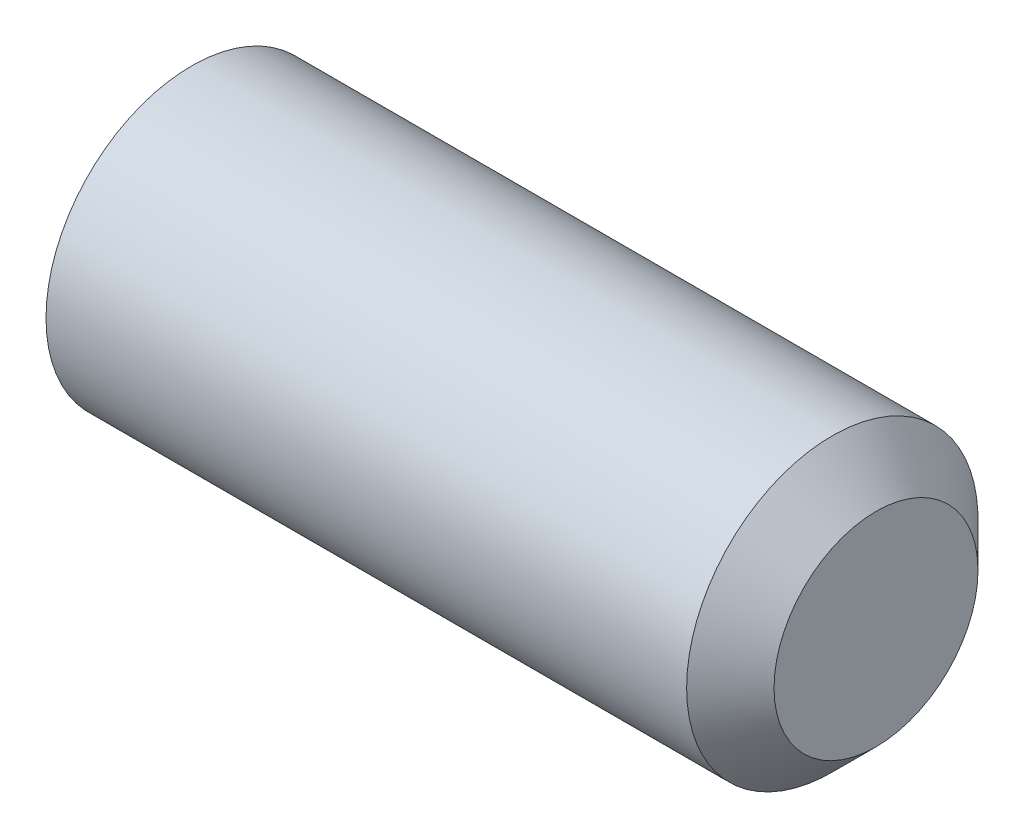
ISO-10303-21;
HEADER;
FILE_DESCRIPTION(('STEP AP214'),'2;1');
FILE_NAME('part.step','',(''),(''),'','','');
FILE_SCHEMA(('AUTOMOTIVE_DESIGN { 1 0 10303 214 1 1 1 1 }'));
ENDSEC;
DATA;
#1=APPLICATION_CONTEXT('core data for automotive mechanical design processes');
#2=APPLICATION_PROTOCOL_DEFINITION('international standard','automotive_design',2000,#1);
#3=PRODUCT_CONTEXT('',#1,'mechanical');
#4=PRODUCT('Part','Part','',(#3));
#5=PRODUCT_RELATED_PRODUCT_CATEGORY('part','',(#4));
#6=PRODUCT_DEFINITION_FORMATION('','',#4);
#7=PRODUCT_DEFINITION_CONTEXT('part definition',#1,'design');
#8=PRODUCT_DEFINITION('design','',#6,#7);
#9=PRODUCT_DEFINITION_SHAPE('','',#8);
#10=(LENGTH_UNIT() NAMED_UNIT(*) SI_UNIT(.MILLI.,.METRE.));
#11=(NAMED_UNIT(*) PLANE_ANGLE_UNIT() SI_UNIT($,.RADIAN.));
#12=(NAMED_UNIT(*) SI_UNIT($,.STERADIAN.) SOLID_ANGLE_UNIT());
#13=UNCERTAINTY_MEASURE_WITH_UNIT(LENGTH_MEASURE(1.E-05),#10,'distance_accuracy_value','');
#14=(GEOMETRIC_REPRESENTATION_CONTEXT(3) GLOBAL_UNCERTAINTY_ASSIGNED_CONTEXT((#13)) GLOBAL_UNIT_ASSIGNED_CONTEXT((#10,
#11,#12)) REPRESENTATION_CONTEXT('',''));
#15=CARTESIAN_POINT('',(0.,0.,0.));
#16=DIRECTION('',(0.,0.,1.));
#17=DIRECTION('',(1.,0.,0.));
#18=AXIS2_PLACEMENT_3D('',#15,#16,#17);
#19=CARTESIAN_POINT('',(0.,0.,0.));
#20=DIRECTION('',(-1.,0.,0.));
#21=DIRECTION('',(0.,0.,1.));
#22=AXIS2_PLACEMENT_3D('',#19,#20,#21);
#23=PLANE('',#22);
#24=CARTESIAN_POINT('',(0.,0.,0.));
#25=DIRECTION('',(-1.,0.,0.));
#26=DIRECTION('',(0.,0.,1.));
#27=AXIS2_PLACEMENT_3D('',#24,#25,#26);
#28=CIRCLE('',#27,2.055);
#29=CARTESIAN_POINT('',(0.,0.,2.055));
#30=VERTEX_POINT('',#29);
#31=EDGE_CURVE('E137',#30,#30,#28,.T.);
#32=ORIENTED_EDGE('',*,*,#31,.T.);
#33=EDGE_LOOP('',(#32));
#34=FACE_BOUND('',#33,.T.);
#35=DIRECTION('',(0.,0.,-1.));
#36=VECTOR('',#35,1.);
#37=CARTESIAN_POINT('',(0.,1.25,0.721687836487029));
#38=LINE('',#37,#36);
#39=CARTESIAN_POINT('',(0.,1.25,0.721687836487029));
#40=VERTEX_POINT('',#39);
#41=CARTESIAN_POINT('',(0.,1.25,-0.721687836487035));
#42=VERTEX_POINT('',#41);
#43=EDGE_CURVE('E128',#40,#42,#38,.T.);
#44=ORIENTED_EDGE('',*,*,#43,.F.);
#45=DIRECTION('',(0.,-0.866025403784438,0.5));
#46=VECTOR('',#45,1.);
#47=CARTESIAN_POINT('',(0.,1.25,0.721687836487029));
#48=LINE('',#47,#46);
#49=CARTESIAN_POINT('',(0.,0.,1.44337567297406));
#50=VERTEX_POINT('',#49);
#51=EDGE_CURVE('E50',#40,#50,#48,.T.);
#52=ORIENTED_EDGE('',*,*,#51,.T.);
#53=DIRECTION('',(0.,0.866025403784439,0.5));
#54=VECTOR('',#53,1.);
#55=CARTESIAN_POINT('',(0.,-1.25,0.72168783648703));
#56=LINE('',#55,#54);
#57=CARTESIAN_POINT('',(0.,-1.25,0.72168783648703));
#58=VERTEX_POINT('',#57);
#59=EDGE_CURVE('E119',#58,#50,#56,.T.);
#60=ORIENTED_EDGE('',*,*,#59,.F.);
#61=DIRECTION('',(0.,0.,-1.));
#62=VECTOR('',#61,1.);
#63=CARTESIAN_POINT('',(0.,-1.25,0.72168783648703));
#64=LINE('',#63,#62);
#65=CARTESIAN_POINT('',(0.,-1.25,-0.721687836487034));
#66=VERTEX_POINT('',#65);
#67=EDGE_CURVE('E122',#58,#66,#64,.T.);
#68=ORIENTED_EDGE('',*,*,#67,.T.);
#69=DIRECTION('',(0.,0.866025403784438,-0.500000000000001));
#70=VECTOR('',#69,1.);
#71=CARTESIAN_POINT('',(0.,-1.25,-0.721687836487034));
#72=LINE('',#71,#70);
#73=CARTESIAN_POINT('',(0.,0.,-1.44337567297407));
#74=VERTEX_POINT('',#73);
#75=EDGE_CURVE('E125',#66,#74,#72,.T.);
#76=ORIENTED_EDGE('',*,*,#75,.T.);
#77=DIRECTION('',(0.,-0.866025403784439,-0.5));
#78=VECTOR('',#77,1.);
#79=CARTESIAN_POINT('',(0.,1.25,-0.721687836487035));
#80=LINE('',#79,#78);
#81=EDGE_CURVE('E108',#42,#74,#80,.T.);
#82=ORIENTED_EDGE('',*,*,#81,.F.);
#83=EDGE_LOOP('',(#44,#52,#60,#68,#76,#82));
#84=FACE_BOUND('',#83,.T.);
#85=ADVANCED_FACE('F35',(#34,#84),#23,.T.);
#86=CARTESIAN_POINT('',(12.,1.75,0.));
#87=DIRECTION('',(1.,0.,0.));
#88=DIRECTION('',(0.,0.,-1.));
#89=AXIS2_PLACEMENT_3D('',#86,#87,#88);
#90=PLANE('',#89);
#91=CARTESIAN_POINT('',(12.,0.,0.));
#92=DIRECTION('',(-1.,0.,0.));
#93=DIRECTION('',(0.,0.,1.));
#94=AXIS2_PLACEMENT_3D('',#91,#92,#93);
#95=CIRCLE('',#94,1.75);
#96=CARTESIAN_POINT('',(12.,0.,1.75));
#97=VERTEX_POINT('',#96);
#98=EDGE_CURVE('E11',#97,#97,#95,.T.);
#99=ORIENTED_EDGE('',*,*,#98,.F.);
#100=EDGE_LOOP('',(#99));
#101=FACE_BOUND('',#100,.T.);
#102=ADVANCED_FACE('F37',(#101),#90,.T.);
#103=CARTESIAN_POINT('',(11.25,0.,0.));
#104=DIRECTION('',(-1.,0.,0.));
#105=DIRECTION('',(0.,0.,1.));
#106=AXIS2_PLACEMENT_3D('',#103,#104,#105);
#107=CONICAL_SURFACE('',#106,2.5,0.785398163397455);
#108=ORIENTED_EDGE('',*,*,#98,.T.);
#109=EDGE_LOOP('',(#108));
#110=FACE_BOUND('',#109,.T.);
#111=CARTESIAN_POINT('',(11.25,0.,0.));
#112=DIRECTION('',(-1.,0.,0.));
#113=DIRECTION('',(0.,0.,1.));
#114=AXIS2_PLACEMENT_3D('',#111,#112,#113);
#115=CIRCLE('',#114,2.5);
#116=CARTESIAN_POINT('',(11.25,0.,2.5));
#117=VERTEX_POINT('',#116);
#118=EDGE_CURVE('E43',#117,#117,#115,.T.);
#119=ORIENTED_EDGE('',*,*,#118,.F.);
#120=EDGE_LOOP('',(#119));
#121=FACE_BOUND('',#120,.T.);
#122=ADVANCED_FACE('F148',(#110,#121),#107,.T.);
#123=CARTESIAN_POINT('',(-12.7,0.,0.));
#124=DIRECTION('',(-1.,0.,0.));
#125=DIRECTION('',(0.,0.,1.));
#126=AXIS2_PLACEMENT_3D('',#123,#124,#125);
#127=CYLINDRICAL_SURFACE('',#126,2.5);
#128=ORIENTED_EDGE('',*,*,#118,.T.);
#129=EDGE_LOOP('',(#128));
#130=FACE_BOUND('',#129,.T.);
#131=CARTESIAN_POINT('',(0.256920869789382,0.,0.));
#132=DIRECTION('',(-1.,0.,0.));
#133=DIRECTION('',(0.,0.,1.));
#134=AXIS2_PLACEMENT_3D('',#131,#132,#133);
#135=CIRCLE('',#134,2.5);
#136=CARTESIAN_POINT('',(0.256920869789382,0.,2.5));
#137=VERTEX_POINT('',#136);
#138=EDGE_CURVE('E140',#137,#137,#135,.T.);
#139=ORIENTED_EDGE('',*,*,#138,.F.);
#140=EDGE_LOOP('',(#139));
#141=FACE_BOUND('',#140,.T.);
#142=ADVANCED_FACE('F145',(#130,#141),#127,.T.);
#143=CARTESIAN_POINT('',(0.,0.,0.));
#144=DIRECTION('',(1.,0.,0.));
#145=DIRECTION('',(0.,0.,-1.));
#146=AXIS2_PLACEMENT_3D('',#143,#144,#145);
#147=CONICAL_SURFACE('',#146,2.055,1.0471975511966);
#148=ORIENTED_EDGE('',*,*,#138,.T.);
#149=EDGE_LOOP('',(#148));
#150=FACE_BOUND('',#149,.T.);
#151=ORIENTED_EDGE('',*,*,#31,.F.);
#152=EDGE_LOOP('',(#151));
#153=FACE_BOUND('',#152,.T.);
#154=ADVANCED_FACE('F155',(#150,#153),#147,.T.);
#155=CARTESIAN_POINT('',(3.,1.25,0.721687836487029));
#156=DIRECTION('',(0.,-0.500000000000001,-0.866025403784438));
#157=DIRECTION('',(0.,0.866025403784438,-0.500000000000001));
#158=AXIS2_PLACEMENT_3D('',#155,#156,#157);
#159=PLANE('',#158);
#160=ORIENTED_EDGE('',*,*,#51,.F.);
#161=DIRECTION('',(-1.,0.,0.));
#162=VECTOR('',#161,1.);
#163=CARTESIAN_POINT('',(3.,1.25,0.721687836487029));
#164=LINE('',#163,#162);
#165=CARTESIAN_POINT('',(3.,1.25,0.721687836487029));
#166=VERTEX_POINT('',#165);
#167=EDGE_CURVE('E55',#166,#40,#164,.T.);
#168=ORIENTED_EDGE('',*,*,#167,.F.);
#169=DIRECTION('',(0.,-0.866025403784438,0.5));
#170=VECTOR('',#169,1.);
#171=CARTESIAN_POINT('',(3.,1.25,0.721687836487029));
#172=LINE('',#171,#170);
#173=CARTESIAN_POINT('',(3.,0.,1.44337567297406));
#174=VERTEX_POINT('',#173);
#175=EDGE_CURVE('E82',#166,#174,#172,.T.);
#176=ORIENTED_EDGE('',*,*,#175,.T.);
#177=DIRECTION('',(-1.,0.,0.));
#178=VECTOR('',#177,1.);
#179=CARTESIAN_POINT('',(3.,0.,1.44337567297406));
#180=LINE('',#179,#178);
#181=EDGE_CURVE('E135',#174,#50,#180,.T.);
#182=ORIENTED_EDGE('',*,*,#181,.T.);
#183=EDGE_LOOP('',(#160,#168,#176,#182));
#184=FACE_BOUND('',#183,.T.);
#185=ADVANCED_FACE('F166',(#184),#159,.T.);
#186=CARTESIAN_POINT('',(3.,-1.25,0.72168783648703));
#187=DIRECTION('',(0.,-0.5,0.866025403784439));
#188=DIRECTION('',(0.,-0.866025403784439,-0.5));
#189=AXIS2_PLACEMENT_3D('',#186,#187,#188);
#190=PLANE('',#189);
#191=ORIENTED_EDGE('',*,*,#59,.T.);
#192=ORIENTED_EDGE('',*,*,#181,.F.);
#193=DIRECTION('',(0.,0.866025403784439,0.5));
#194=VECTOR('',#193,1.);
#195=CARTESIAN_POINT('',(3.,-1.25,0.72168783648703));
#196=LINE('',#195,#194);
#197=CARTESIAN_POINT('',(3.,-1.25,0.72168783648703));
#198=VERTEX_POINT('',#197);
#199=EDGE_CURVE('E266',#198,#174,#196,.T.);
#200=ORIENTED_EDGE('',*,*,#199,.F.);
#201=DIRECTION('',(-1.,0.,0.));
#202=VECTOR('',#201,1.);
#203=CARTESIAN_POINT('',(3.,-1.25,0.72168783648703));
#204=LINE('',#203,#202);
#205=EDGE_CURVE('E133',#198,#58,#204,.T.);
#206=ORIENTED_EDGE('',*,*,#205,.T.);
#207=EDGE_LOOP('',(#191,#192,#200,#206));
#208=FACE_BOUND('',#207,.T.);
#209=ADVANCED_FACE('F173',(#208),#190,.F.);
#210=CARTESIAN_POINT('',(3.,-1.25,0.72168783648703));
#211=DIRECTION('',(0.,1.,0.));
#212=DIRECTION('',(0.,0.,1.));
#213=AXIS2_PLACEMENT_3D('',#210,#211,#212);
#214=PLANE('',#213);
#215=ORIENTED_EDGE('',*,*,#67,.F.);
#216=ORIENTED_EDGE('',*,*,#205,.F.);
#217=DIRECTION('',(0.,0.,-1.));
#218=VECTOR('',#217,1.);
#219=CARTESIAN_POINT('',(3.,-1.25,0.72168783648703));
#220=LINE('',#219,#218);
#221=CARTESIAN_POINT('',(3.,-1.25,-0.721687836487034));
#222=VERTEX_POINT('',#221);
#223=EDGE_CURVE('E103',#198,#222,#220,.T.);
#224=ORIENTED_EDGE('',*,*,#223,.T.);
#225=DIRECTION('',(-1.,0.,0.));
#226=VECTOR('',#225,1.);
#227=CARTESIAN_POINT('',(3.,-1.25,-0.721687836487034));
#228=LINE('',#227,#226);
#229=EDGE_CURVE('E98',#222,#66,#228,.T.);
#230=ORIENTED_EDGE('',*,*,#229,.T.);
#231=EDGE_LOOP('',(#215,#216,#224,#230));
#232=FACE_BOUND('',#231,.T.);
#233=ADVANCED_FACE('F180',(#232),#214,.T.);
#234=CARTESIAN_POINT('',(3.,-1.25,-0.721687836487034));
#235=DIRECTION('',(0.,0.500000000000001,0.866025403784438));
#236=DIRECTION('',(0.,-0.866025403784438,0.500000000000001));
#237=AXIS2_PLACEMENT_3D('',#234,#235,#236);
#238=PLANE('',#237);
#239=ORIENTED_EDGE('',*,*,#75,.F.);
#240=ORIENTED_EDGE('',*,*,#229,.F.);
#241=DIRECTION('',(0.,0.866025403784438,-0.500000000000001));
#242=VECTOR('',#241,1.);
#243=CARTESIAN_POINT('',(3.,-1.25,-0.721687836487034));
#244=LINE('',#243,#242);
#245=CARTESIAN_POINT('',(3.,0.,-1.44337567297407));
#246=VERTEX_POINT('',#245);
#247=EDGE_CURVE('E93',#222,#246,#244,.T.);
#248=ORIENTED_EDGE('',*,*,#247,.T.);
#249=DIRECTION('',(-1.,0.,0.));
#250=VECTOR('',#249,1.);
#251=CARTESIAN_POINT('',(3.,0.,-1.44337567297407));
#252=LINE('',#251,#250);
#253=EDGE_CURVE('E97',#246,#74,#252,.T.);
#254=ORIENTED_EDGE('',*,*,#253,.T.);
#255=EDGE_LOOP('',(#239,#240,#248,#254));
#256=FACE_BOUND('',#255,.T.);
#257=ADVANCED_FACE('F96',(#256),#238,.T.);
#258=CARTESIAN_POINT('',(3.,1.25,-0.721687836487035));
#259=DIRECTION('',(0.,0.5,-0.866025403784439));
#260=DIRECTION('',(0.,0.866025403784439,0.5));
#261=AXIS2_PLACEMENT_3D('',#258,#259,#260);
#262=PLANE('',#261);
#263=ORIENTED_EDGE('',*,*,#81,.T.);
#264=ORIENTED_EDGE('',*,*,#253,.F.);
#265=DIRECTION('',(0.,-0.866025403784439,-0.5));
#266=VECTOR('',#265,1.);
#267=CARTESIAN_POINT('',(3.,1.25,-0.721687836487035));
#268=LINE('',#267,#266);
#269=CARTESIAN_POINT('',(3.,1.25,-0.721687836487035));
#270=VERTEX_POINT('',#269);
#271=EDGE_CURVE('E102',#270,#246,#268,.T.);
#272=ORIENTED_EDGE('',*,*,#271,.F.);
#273=DIRECTION('',(-1.,0.,0.));
#274=VECTOR('',#273,1.);
#275=CARTESIAN_POINT('',(3.,1.25,-0.721687836487035));
#276=LINE('',#275,#274);
#277=EDGE_CURVE('E78',#270,#42,#276,.T.);
#278=ORIENTED_EDGE('',*,*,#277,.T.);
#279=EDGE_LOOP('',(#263,#264,#272,#278));
#280=FACE_BOUND('',#279,.T.);
#281=ADVANCED_FACE('F105',(#280),#262,.F.);
#282=CARTESIAN_POINT('',(3.,1.25,0.721687836487029));
#283=DIRECTION('',(0.,1.,0.));
#284=DIRECTION('',(0.,0.,1.));
#285=AXIS2_PLACEMENT_3D('',#282,#283,#284);
#286=PLANE('',#285);
#287=ORIENTED_EDGE('',*,*,#43,.T.);
#288=ORIENTED_EDGE('',*,*,#277,.F.);
#289=DIRECTION('',(0.,0.,-1.));
#290=VECTOR('',#289,1.);
#291=CARTESIAN_POINT('',(3.,1.25,0.721687836487029));
#292=LINE('',#291,#290);
#293=EDGE_CURVE('E113',#166,#270,#292,.T.);
#294=ORIENTED_EDGE('',*,*,#293,.F.);
#295=ORIENTED_EDGE('',*,*,#167,.T.);
#296=EDGE_LOOP('',(#287,#288,#294,#295));
#297=FACE_BOUND('',#296,.T.);
#298=ADVANCED_FACE('F192',(#297),#286,.F.);
#299=CARTESIAN_POINT('',(3.,2.5,0.));
#300=DIRECTION('',(1.,0.,0.));
#301=DIRECTION('',(0.,0.,-1.));
#302=AXIS2_PLACEMENT_3D('',#299,#300,#301);
#303=PLANE('',#302);
#304=ORIENTED_EDGE('',*,*,#175,.F.);
#305=ORIENTED_EDGE('',*,*,#293,.T.);
#306=ORIENTED_EDGE('',*,*,#271,.T.);
#307=ORIENTED_EDGE('',*,*,#247,.F.);
#308=ORIENTED_EDGE('',*,*,#223,.F.);
#309=ORIENTED_EDGE('',*,*,#199,.T.);
#310=EDGE_LOOP('',(#304,#305,#306,#307,#308,#309));
#311=FACE_BOUND('',#310,.T.);
#312=ADVANCED_FACE('F111',(#311),#303,.F.);
#313=CLOSED_SHELL('',(#85,#102,#122,#142,#154,#185,#209,#233,#257,#281,#298,#312));
#314=MANIFOLD_SOLID_BREP('B2',#313);
#315=ADVANCED_BREP_SHAPE_REPRESENTATION('',(#18,#314),#14);
#316=SHAPE_DEFINITION_REPRESENTATION(#9,#315);
ENDSEC;
END-ISO-10303-21;
